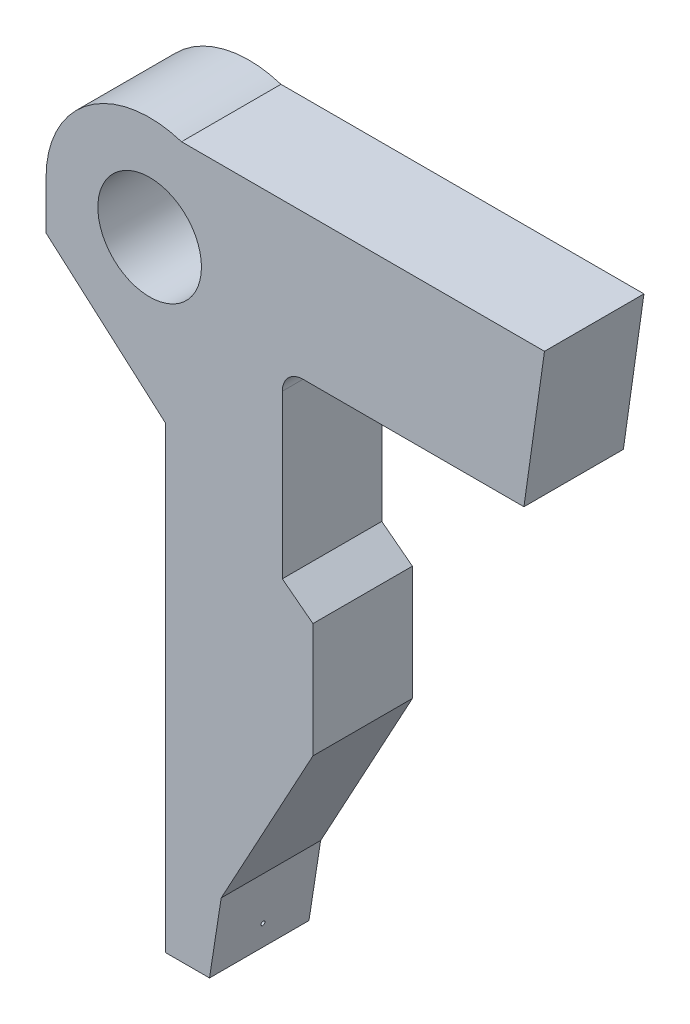
ISO-10303-21;
HEADER;
FILE_DESCRIPTION(('STEP AP214'),'2;1');
FILE_NAME('part.step','',(''),(''),'','','');
FILE_SCHEMA(('AUTOMOTIVE_DESIGN { 1 0 10303 214 1 1 1 1 }'));
ENDSEC;
DATA;
#1=APPLICATION_CONTEXT('core data for automotive mechanical design processes');
#2=APPLICATION_PROTOCOL_DEFINITION('international standard','automotive_design',2000,#1);
#3=PRODUCT_CONTEXT('',#1,'mechanical');
#4=PRODUCT('Part','Part','',(#3));
#5=PRODUCT_RELATED_PRODUCT_CATEGORY('part','',(#4));
#6=PRODUCT_DEFINITION_FORMATION('','',#4);
#7=PRODUCT_DEFINITION_CONTEXT('part definition',#1,'design');
#8=PRODUCT_DEFINITION('design','',#6,#7);
#9=PRODUCT_DEFINITION_SHAPE('','',#8);
#10=(LENGTH_UNIT() NAMED_UNIT(*) SI_UNIT(.MILLI.,.METRE.));
#11=(NAMED_UNIT(*) PLANE_ANGLE_UNIT() SI_UNIT($,.RADIAN.));
#12=(NAMED_UNIT(*) SI_UNIT($,.STERADIAN.) SOLID_ANGLE_UNIT());
#13=UNCERTAINTY_MEASURE_WITH_UNIT(LENGTH_MEASURE(1.E-05),#10,'distance_accuracy_value','');
#14=(GEOMETRIC_REPRESENTATION_CONTEXT(3) GLOBAL_UNCERTAINTY_ASSIGNED_CONTEXT((#13)) GLOBAL_UNIT_ASSIGNED_CONTEXT((#10,
#11,#12)) REPRESENTATION_CONTEXT('',''));
#15=CARTESIAN_POINT('',(0.,0.,0.));
#16=DIRECTION('',(0.,0.,1.));
#17=DIRECTION('',(1.,0.,0.));
#18=AXIS2_PLACEMENT_3D('',#15,#16,#17);
#19=CARTESIAN_POINT('',(6.40208237027269,0.,4.8));
#20=DIRECTION('',(-1.,0.,0.));
#21=DIRECTION('',(0.,-1.,0.));
#22=AXIS2_PLACEMENT_3D('',#19,#20,#21);
#23=PLANE('',#22);
#24=DIRECTION('',(0.,1.,0.));
#25=VECTOR('',#24,1.);
#26=CARTESIAN_POINT('',(6.40208237027269,0.,0.));
#27=LINE('',#26,#25);
#28=CARTESIAN_POINT('',(6.40208237027269,-11.0792552576076,0.));
#29=VERTEX_POINT('',#28);
#30=CARTESIAN_POINT('',(6.40208237027269,-3.2376102121532,0.));
#31=VERTEX_POINT('',#30);
#32=EDGE_CURVE('E171',#29,#31,#27,.T.);
#33=ORIENTED_EDGE('',*,*,#32,.T.);
#34=DIRECTION('',(0.,0.,-1.));
#35=VECTOR('',#34,1.);
#36=CARTESIAN_POINT('',(6.40208237027269,-3.2376102121532,4.8));
#37=LINE('',#36,#35);
#38=CARTESIAN_POINT('',(6.40208237027269,-3.2376102121532,4.8));
#39=VERTEX_POINT('',#38);
#40=EDGE_CURVE('E11',#39,#31,#37,.T.);
#41=ORIENTED_EDGE('',*,*,#40,.F.);
#42=DIRECTION('',(0.,1.,0.));
#43=VECTOR('',#42,1.);
#44=CARTESIAN_POINT('',(6.40208237027269,0.,4.8));
#45=LINE('',#44,#43);
#46=CARTESIAN_POINT('',(6.40208237027269,-11.0792552576076,4.8));
#47=VERTEX_POINT('',#46);
#48=EDGE_CURVE('E201',#47,#39,#45,.T.);
#49=ORIENTED_EDGE('',*,*,#48,.F.);
#50=DIRECTION('',(0.,0.,-1.));
#51=VECTOR('',#50,1.);
#52=CARTESIAN_POINT('',(6.40208237027269,-11.0792552576076,4.8));
#53=LINE('',#52,#51);
#54=EDGE_CURVE('E170',#47,#29,#53,.T.);
#55=ORIENTED_EDGE('',*,*,#54,.T.);
#56=EDGE_LOOP('',(#33,#41,#49,#55));
#57=FACE_BOUND('',#56,.T.);
#58=ADVANCED_FACE('F35',(#57),#23,.F.);
#59=CARTESIAN_POINT('',(7.40208237027269,-3.2376102121532,4.8));
#60=DIRECTION('',(0.,0.,-1.));
#61=DIRECTION('',(-1.,0.,0.));
#62=AXIS2_PLACEMENT_3D('',#59,#60,#61);
#63=CYLINDRICAL_SURFACE('',#62,0.999999999999999);
#64=CARTESIAN_POINT('',(7.40208237027269,-3.2376102121532,0.));
#65=DIRECTION('',(0.,0.,1.));
#66=DIRECTION('',(1.,0.,0.));
#67=AXIS2_PLACEMENT_3D('',#64,#65,#66);
#68=CIRCLE('',#67,0.999999999999999);
#69=CARTESIAN_POINT('',(7.40208237027269,-2.2376102121532,0.));
#70=VERTEX_POINT('',#69);
#71=EDGE_CURVE('E174',#31,#70,#68,.F.);
#72=ORIENTED_EDGE('',*,*,#71,.T.);
#73=DIRECTION('',(0.,0.,-1.));
#74=VECTOR('',#73,1.);
#75=CARTESIAN_POINT('',(7.40208237027269,-2.2376102121532,4.8));
#76=LINE('',#75,#74);
#77=CARTESIAN_POINT('',(7.40208237027269,-2.2376102121532,4.8));
#78=VERTEX_POINT('',#77);
#79=EDGE_CURVE('E43',#78,#70,#76,.T.);
#80=ORIENTED_EDGE('',*,*,#79,.F.);
#81=CARTESIAN_POINT('',(7.40208237027269,-3.2376102121532,4.8));
#82=DIRECTION('',(0.,0.,1.));
#83=DIRECTION('',(1.,0.,0.));
#84=AXIS2_PLACEMENT_3D('',#81,#82,#83);
#85=CIRCLE('',#84,0.999999999999999);
#86=EDGE_CURVE('E112',#39,#78,#85,.F.);
#87=ORIENTED_EDGE('',*,*,#86,.F.);
#88=ORIENTED_EDGE('',*,*,#40,.T.);
#89=EDGE_LOOP('',(#72,#80,#87,#88));
#90=FACE_BOUND('',#89,.T.);
#91=ADVANCED_FACE('F291',(#90),#63,.F.);
#92=CARTESIAN_POINT('',(0.,-2.2376102121532,4.8));
#93=DIRECTION('',(0.,1.,0.));
#94=DIRECTION('',(-1.,0.,0.));
#95=AXIS2_PLACEMENT_3D('',#92,#93,#94);
#96=PLANE('',#95);
#97=DIRECTION('',(1.,0.,0.));
#98=VECTOR('',#97,1.);
#99=CARTESIAN_POINT('',(0.,-2.2376102121532,0.));
#100=LINE('',#99,#98);
#101=CARTESIAN_POINT('',(18.063612226188,-2.2376102121532,0.));
#102=VERTEX_POINT('',#101);
#103=EDGE_CURVE('E177',#70,#102,#100,.T.);
#104=ORIENTED_EDGE('',*,*,#103,.T.);
#105=DIRECTION('',(0.,0.,-1.));
#106=VECTOR('',#105,1.);
#107=CARTESIAN_POINT('',(18.063612226188,-2.2376102121532,4.8));
#108=LINE('',#107,#106);
#109=CARTESIAN_POINT('',(18.063612226188,-2.2376102121532,4.8));
#110=VERTEX_POINT('',#109);
#111=EDGE_CURVE('E226',#110,#102,#108,.T.);
#112=ORIENTED_EDGE('',*,*,#111,.F.);
#113=DIRECTION('',(1.,0.,0.));
#114=VECTOR('',#113,1.);
#115=CARTESIAN_POINT('',(0.,-2.2376102121532,4.8));
#116=LINE('',#115,#114);
#117=EDGE_CURVE('E234',#78,#110,#116,.T.);
#118=ORIENTED_EDGE('',*,*,#117,.F.);
#119=ORIENTED_EDGE('',*,*,#79,.T.);
#120=EDGE_LOOP('',(#104,#112,#118,#119));
#121=FACE_BOUND('',#120,.T.);
#122=ADVANCED_FACE('F232',(#121),#96,.F.);
#123=CARTESIAN_POINT('',(18.0184346235268,-2.55607840833381,4.8));
#124=DIRECTION('',(-0.990087364863809,0.140452874434947,0.));
#125=DIRECTION('',(-0.140452874434947,-0.990087364863809,0.));
#126=AXIS2_PLACEMENT_3D('',#123,#124,#125);
#127=PLANE('',#126);
#128=DIRECTION('',(0.140452874434947,0.990087364863809,0.));
#129=VECTOR('',#128,1.);
#130=CARTESIAN_POINT('',(18.0184346235268,-2.55607840833381,0.));
#131=LINE('',#130,#129);
#132=CARTESIAN_POINT('',(19.0560025989645,4.7579971974597,0.));
#133=VERTEX_POINT('',#132);
#134=EDGE_CURVE('E179',#102,#133,#131,.T.);
#135=ORIENTED_EDGE('',*,*,#134,.T.);
#136=DIRECTION('',(0.,0.,-1.));
#137=VECTOR('',#136,1.);
#138=CARTESIAN_POINT('',(19.0560025989645,4.7579971974597,4.8));
#139=LINE('',#138,#137);
#140=CARTESIAN_POINT('',(19.0560025989645,4.7579971974597,4.8));
#141=VERTEX_POINT('',#140);
#142=EDGE_CURVE('E223',#141,#133,#139,.T.);
#143=ORIENTED_EDGE('',*,*,#142,.F.);
#144=DIRECTION('',(0.140452874434947,0.990087364863809,0.));
#145=VECTOR('',#144,1.);
#146=CARTESIAN_POINT('',(18.0184346235268,-2.55607840833381,4.8));
#147=LINE('',#146,#145);
#148=EDGE_CURVE('E253',#110,#141,#147,.T.);
#149=ORIENTED_EDGE('',*,*,#148,.F.);
#150=ORIENTED_EDGE('',*,*,#111,.T.);
#151=EDGE_LOOP('',(#135,#143,#149,#150));
#152=FACE_BOUND('',#151,.T.);
#153=ADVANCED_FACE('F244',(#152),#127,.F.);
#154=CARTESIAN_POINT('',(0.,4.7579971974597,4.8));
#155=DIRECTION('',(0.,-1.,0.));
#156=DIRECTION('',(0.,0.,-1.));
#157=AXIS2_PLACEMENT_3D('',#154,#155,#156);
#158=PLANE('',#157);
#159=DIRECTION('',(-1.,0.,0.));
#160=VECTOR('',#159,1.);
#161=CARTESIAN_POINT('',(0.,4.7579971974597,0.));
#162=LINE('',#161,#160);
#163=CARTESIAN_POINT('',(1.53670513403374,4.7579971974597,0.));
#164=VERTEX_POINT('',#163);
#165=EDGE_CURVE('E181',#133,#164,#162,.T.);
#166=ORIENTED_EDGE('',*,*,#165,.T.);
#167=DIRECTION('',(0.,0.,-1.));
#168=VECTOR('',#167,1.);
#169=CARTESIAN_POINT('',(1.53670513403374,4.7579971974597,4.8));
#170=LINE('',#169,#168);
#171=CARTESIAN_POINT('',(1.53670513403374,4.7579971974597,4.8));
#172=VERTEX_POINT('',#171);
#173=EDGE_CURVE('E220',#172,#164,#170,.T.);
#174=ORIENTED_EDGE('',*,*,#173,.F.);
#175=DIRECTION('',(-1.,0.,0.));
#176=VECTOR('',#175,1.);
#177=CARTESIAN_POINT('',(0.,4.7579971974597,4.8));
#178=LINE('',#177,#176);
#179=EDGE_CURVE('E250',#141,#172,#178,.T.);
#180=ORIENTED_EDGE('',*,*,#179,.F.);
#181=ORIENTED_EDGE('',*,*,#142,.T.);
#182=EDGE_LOOP('',(#166,#174,#180,#181));
#183=FACE_BOUND('',#182,.T.);
#184=ADVANCED_FACE('F248',(#183),#158,.F.);
#185=CARTESIAN_POINT('',(0.,0.,4.8));
#186=DIRECTION('',(0.,0.,-1.));
#187=DIRECTION('',(-1.,0.,0.));
#188=AXIS2_PLACEMENT_3D('',#185,#186,#187);
#189=CYLINDRICAL_SURFACE('',#188,5.);
#190=CARTESIAN_POINT('',(0.,0.,0.));
#191=DIRECTION('',(0.,0.,1.));
#192=DIRECTION('',(1.,0.,0.));
#193=AXIS2_PLACEMENT_3D('',#190,#191,#192);
#194=CIRCLE('',#193,5.);
#195=CARTESIAN_POINT('',(-5.,0.,0.));
#196=VERTEX_POINT('',#195);
#197=EDGE_CURVE('E183',#164,#196,#194,.T.);
#198=ORIENTED_EDGE('',*,*,#197,.T.);
#199=DIRECTION('',(0.,0.,-1.));
#200=VECTOR('',#199,1.);
#201=CARTESIAN_POINT('',(-5.,0.,4.8));
#202=LINE('',#201,#200);
#203=CARTESIAN_POINT('',(-5.,0.,4.8));
#204=VERTEX_POINT('',#203);
#205=EDGE_CURVE('E217',#204,#196,#202,.T.);
#206=ORIENTED_EDGE('',*,*,#205,.F.);
#207=CARTESIAN_POINT('',(0.,0.,4.8));
#208=DIRECTION('',(0.,0.,1.));
#209=DIRECTION('',(1.,0.,0.));
#210=AXIS2_PLACEMENT_3D('',#207,#208,#209);
#211=CIRCLE('',#210,5.);
#212=EDGE_CURVE('E252',#172,#204,#211,.T.);
#213=ORIENTED_EDGE('',*,*,#212,.F.);
#214=ORIENTED_EDGE('',*,*,#173,.T.);
#215=EDGE_LOOP('',(#198,#206,#213,#214));
#216=FACE_BOUND('',#215,.T.);
#217=ADVANCED_FACE('F304',(#216),#189,.T.);
#218=CARTESIAN_POINT('',(-5.,0.,4.8));
#219=DIRECTION('',(1.,0.,0.));
#220=DIRECTION('',(0.,0.,-1.));
#221=AXIS2_PLACEMENT_3D('',#218,#219,#220);
#222=PLANE('',#221);
#223=DIRECTION('',(0.,-1.,0.));
#224=VECTOR('',#223,1.);
#225=CARTESIAN_POINT('',(-5.,0.,0.));
#226=LINE('',#225,#224);
#227=CARTESIAN_POINT('',(-5.,-2.32647439688253,0.));
#228=VERTEX_POINT('',#227);
#229=EDGE_CURVE('E185',#196,#228,#226,.T.);
#230=ORIENTED_EDGE('',*,*,#229,.T.);
#231=DIRECTION('',(0.,0.,-1.));
#232=VECTOR('',#231,1.);
#233=CARTESIAN_POINT('',(-5.,-2.32647439688253,4.8));
#234=LINE('',#233,#232);
#235=CARTESIAN_POINT('',(-5.,-2.32647439688253,4.8));
#236=VERTEX_POINT('',#235);
#237=EDGE_CURVE('E214',#236,#228,#234,.T.);
#238=ORIENTED_EDGE('',*,*,#237,.F.);
#239=DIRECTION('',(0.,-1.,0.));
#240=VECTOR('',#239,1.);
#241=CARTESIAN_POINT('',(-5.,0.,4.8));
#242=LINE('',#241,#240);
#243=EDGE_CURVE('E255',#204,#236,#242,.T.);
#244=ORIENTED_EDGE('',*,*,#243,.F.);
#245=ORIENTED_EDGE('',*,*,#205,.T.);
#246=EDGE_LOOP('',(#230,#238,#244,#245));
#247=FACE_BOUND('',#246,.T.);
#248=ADVANCED_FACE('F307',(#247),#222,.F.);
#249=CARTESIAN_POINT('',(-3.32960365921922,-3.79285286398016,4.8));
#250=DIRECTION('',(0.659722162079872,0.751509593325767,0.));
#251=DIRECTION('',(-0.751509593325767,0.659722162079872,0.));
#252=AXIS2_PLACEMENT_3D('',#249,#250,#251);
#253=PLANE('',#252);
#254=DIRECTION('',(0.751509593325767,-0.659722162079872,0.));
#255=VECTOR('',#254,1.);
#256=CARTESIAN_POINT('',(-3.32960365921922,-3.79285286398016,0.));
#257=LINE('',#256,#255);
#258=CARTESIAN_POINT('',(0.754164722411706,-7.3778403745722,0.));
#259=VERTEX_POINT('',#258);
#260=EDGE_CURVE('E187',#228,#259,#257,.T.);
#261=ORIENTED_EDGE('',*,*,#260,.T.);
#262=DIRECTION('',(0.,0.,-1.));
#263=VECTOR('',#262,1.);
#264=CARTESIAN_POINT('',(0.754164722411706,-7.3778403745722,4.8));
#265=LINE('',#264,#263);
#266=CARTESIAN_POINT('',(0.754164722411706,-7.3778403745722,4.8));
#267=VERTEX_POINT('',#266);
#268=EDGE_CURVE('E211',#267,#259,#265,.T.);
#269=ORIENTED_EDGE('',*,*,#268,.F.);
#270=DIRECTION('',(0.751509593325767,-0.659722162079872,0.));
#271=VECTOR('',#270,1.);
#272=CARTESIAN_POINT('',(-3.32960365921922,-3.79285286398016,4.8));
#273=LINE('',#272,#271);
#274=EDGE_CURVE('E261',#236,#267,#273,.T.);
#275=ORIENTED_EDGE('',*,*,#274,.F.);
#276=ORIENTED_EDGE('',*,*,#237,.T.);
#277=EDGE_LOOP('',(#261,#269,#275,#276));
#278=FACE_BOUND('',#277,.T.);
#279=ADVANCED_FACE('F311',(#278),#253,.F.);
#280=CARTESIAN_POINT('',(0.754164722411706,0.,4.8));
#281=DIRECTION('',(1.,0.,0.));
#282=DIRECTION('',(0.,0.,-1.));
#283=AXIS2_PLACEMENT_3D('',#280,#281,#282);
#284=PLANE('',#283);
#285=CARTESIAN_POINT('',(0.754164722411706,-27.0198901160511,2.4));
#286=DIRECTION('',(-1.,0.,0.));
#287=DIRECTION('',(0.,0.,1.));
#288=AXIS2_PLACEMENT_3D('',#285,#286,#287);
#289=CIRCLE('',#288,1.825);
#290=CARTESIAN_POINT('',(0.754164722411706,-27.0198901160511,4.225));
#291=VERTEX_POINT('',#290);
#292=EDGE_CURVE('E414',#291,#291,#289,.T.);
#293=ORIENTED_EDGE('',*,*,#292,.F.);
#294=EDGE_LOOP('',(#293));
#295=FACE_BOUND('',#294,.T.);
#296=DIRECTION('',(0.,-1.,0.));
#297=VECTOR('',#296,1.);
#298=CARTESIAN_POINT('',(0.754164722411706,0.,0.));
#299=LINE('',#298,#297);
#300=CARTESIAN_POINT('',(0.754164722411706,-29.5198901160511,0.));
#301=VERTEX_POINT('',#300);
#302=EDGE_CURVE('E189',#259,#301,#299,.T.);
#303=ORIENTED_EDGE('',*,*,#302,.T.);
#304=DIRECTION('',(0.,0.,-1.));
#305=VECTOR('',#304,1.);
#306=CARTESIAN_POINT('',(0.754164722411706,-29.5198901160511,4.8));
#307=LINE('',#306,#305);
#308=CARTESIAN_POINT('',(0.754164722411706,-29.5198901160511,4.8));
#309=VERTEX_POINT('',#308);
#310=EDGE_CURVE('E208',#309,#301,#307,.T.);
#311=ORIENTED_EDGE('',*,*,#310,.F.);
#312=DIRECTION('',(0.,-1.,0.));
#313=VECTOR('',#312,1.);
#314=CARTESIAN_POINT('',(0.754164722411706,0.,4.8));
#315=LINE('',#314,#313);
#316=EDGE_CURVE('E263',#267,#309,#315,.T.);
#317=ORIENTED_EDGE('',*,*,#316,.F.);
#318=ORIENTED_EDGE('',*,*,#268,.T.);
#319=EDGE_LOOP('',(#303,#311,#317,#318));
#320=FACE_BOUND('',#319,.T.);
#321=ADVANCED_FACE('F315',(#295,#320),#284,.F.);
#322=CARTESIAN_POINT('',(-2.39866646747301E-13,-29.519890116051,4.8));
#323=DIRECTION('',(0.,1.,0.));
#324=DIRECTION('',(-1.,0.,0.));
#325=AXIS2_PLACEMENT_3D('',#322,#323,#324);
#326=PLANE('',#325);
#327=DIRECTION('',(1.,0.,0.));
#328=VECTOR('',#327,1.);
#329=CARTESIAN_POINT('',(-2.39866646747301E-13,-29.519890116051,0.));
#330=LINE('',#329,#328);
#331=CARTESIAN_POINT('',(2.88905288160283,-29.5198901160511,0.));
#332=VERTEX_POINT('',#331);
#333=EDGE_CURVE('E191',#301,#332,#330,.T.);
#334=ORIENTED_EDGE('',*,*,#333,.T.);
#335=DIRECTION('',(0.,0.,-1.));
#336=VECTOR('',#335,1.);
#337=CARTESIAN_POINT('',(2.88905288160283,-29.5198901160511,4.8));
#338=LINE('',#337,#336);
#339=CARTESIAN_POINT('',(2.88905288160283,-29.5198901160511,4.8));
#340=VERTEX_POINT('',#339);
#341=EDGE_CURVE('E205',#340,#332,#338,.T.);
#342=ORIENTED_EDGE('',*,*,#341,.F.);
#343=DIRECTION('',(1.,0.,0.));
#344=VECTOR('',#343,1.);
#345=CARTESIAN_POINT('',(-2.39866646747301E-13,-29.519890116051,4.8));
#346=LINE('',#345,#344);
#347=EDGE_CURVE('E265',#309,#340,#346,.T.);
#348=ORIENTED_EDGE('',*,*,#347,.F.);
#349=ORIENTED_EDGE('',*,*,#310,.T.);
#350=EDGE_LOOP('',(#334,#342,#348,#349));
#351=FACE_BOUND('',#350,.T.);
#352=ADVANCED_FACE('F271',(#351),#326,.F.);
#353=CARTESIAN_POINT('',(7.29737212162931,-1.13324948681235,4.8));
#354=DIRECTION('',(-0.988155457698499,0.153456154717463,0.));
#355=DIRECTION('',(-0.153456154717463,-0.988155457698499,0.));
#356=AXIS2_PLACEMENT_3D('',#353,#354,#355);
#357=PLANE('',#356);
#358=CARTESIAN_POINT('',(3.07152516406432,-28.3448901160511,2.4));
#359=DIRECTION('',(-0.988155457698499,0.153456154717463,0.));
#360=DIRECTION('',(-0.153456154717463,-0.988155457698499,0.));
#361=AXIS2_PLACEMENT_3D('',#358,#359,#360);
#362=ELLIPSE('',#361,0.101198651711046,0.0999999999999997);
#363=CARTESIAN_POINT('',(3.05599560811015,-28.4448901160511,2.4));
#364=VERTEX_POINT('',#363);
#365=EDGE_CURVE('E413',#364,#364,#362,.F.);
#366=ORIENTED_EDGE('',*,*,#365,.F.);
#367=EDGE_LOOP('',(#366));
#368=FACE_BOUND('',#367,.T.);
#369=DIRECTION('',(0.153456154717463,0.988155457698499,0.));
#370=VECTOR('',#369,1.);
#371=CARTESIAN_POINT('',(7.29737212162931,-1.13324948681235,0.));
#372=LINE('',#371,#370);
#373=CARTESIAN_POINT('',(3.45262694445621,-25.8908484067027,0.));
#374=VERTEX_POINT('',#373);
#375=EDGE_CURVE('E193',#332,#374,#372,.T.);
#376=ORIENTED_EDGE('',*,*,#375,.T.);
#377=DIRECTION('',(0.,0.,-1.));
#378=VECTOR('',#377,1.);
#379=CARTESIAN_POINT('',(3.45262694445621,-25.8908484067027,4.8));
#380=LINE('',#379,#378);
#381=CARTESIAN_POINT('',(3.45262694445621,-25.8908484067027,4.8));
#382=VERTEX_POINT('',#381);
#383=EDGE_CURVE('E159',#382,#374,#380,.T.);
#384=ORIENTED_EDGE('',*,*,#383,.F.);
#385=DIRECTION('',(0.153456154717463,0.988155457698499,0.));
#386=VECTOR('',#385,1.);
#387=CARTESIAN_POINT('',(7.29737212162931,-1.13324948681235,4.8));
#388=LINE('',#387,#386);
#389=EDGE_CURVE('E150',#340,#382,#388,.T.);
#390=ORIENTED_EDGE('',*,*,#389,.F.);
#391=ORIENTED_EDGE('',*,*,#341,.T.);
#392=EDGE_LOOP('',(#376,#384,#390,#391));
#393=FACE_BOUND('',#392,.T.);
#394=ADVANCED_FACE('F275',(#368,#393),#357,.F.);
#395=CARTESIAN_POINT('',(13.5263332156528,-7.34866620752027,4.8));
#396=DIRECTION('',(-0.878695413301182,0.477382834466704,0.));
#397=DIRECTION('',(-0.477382834466704,-0.878695413301182,0.));
#398=AXIS2_PLACEMENT_3D('',#395,#396,#397);
#399=PLANE('',#398);
#400=DIRECTION('',(0.477382834466704,0.878695413301182,0.));
#401=VECTOR('',#400,1.);
#402=CARTESIAN_POINT('',(13.5263332156528,-7.34866620752027,0.));
#403=LINE('',#402,#401);
#404=CARTESIAN_POINT('',(7.88035743742888,-17.7409397912093,0.));
#405=VERTEX_POINT('',#404);
#406=EDGE_CURVE('E158',#374,#405,#403,.T.);
#407=ORIENTED_EDGE('',*,*,#406,.T.);
#408=DIRECTION('',(0.,0.,-1.));
#409=VECTOR('',#408,1.);
#410=CARTESIAN_POINT('',(7.88035743742888,-17.7409397912093,4.8));
#411=LINE('',#410,#409);
#412=CARTESIAN_POINT('',(7.88035743742888,-17.7409397912093,4.8));
#413=VERTEX_POINT('',#412);
#414=EDGE_CURVE('E155',#413,#405,#411,.T.);
#415=ORIENTED_EDGE('',*,*,#414,.F.);
#416=DIRECTION('',(0.477382834466704,0.878695413301182,0.));
#417=VECTOR('',#416,1.);
#418=CARTESIAN_POINT('',(13.5263332156528,-7.34866620752027,4.8));
#419=LINE('',#418,#417);
#420=EDGE_CURVE('E143',#382,#413,#419,.T.);
#421=ORIENTED_EDGE('',*,*,#420,.F.);
#422=ORIENTED_EDGE('',*,*,#383,.T.);
#423=EDGE_LOOP('',(#407,#415,#421,#422));
#424=FACE_BOUND('',#423,.T.);
#425=ADVANCED_FACE('F156',(#424),#399,.F.);
#426=CARTESIAN_POINT('',(7.88035743742888,0.,4.8));
#427=DIRECTION('',(-1.,0.,0.));
#428=DIRECTION('',(0.,0.,1.));
#429=AXIS2_PLACEMENT_3D('',#426,#427,#428);
#430=PLANE('',#429);
#431=DIRECTION('',(0.,1.,0.));
#432=VECTOR('',#431,1.);
#433=CARTESIAN_POINT('',(7.88035743742888,0.,0.));
#434=LINE('',#433,#432);
#435=CARTESIAN_POINT('',(7.88035743742888,-12.211059605899,0.));
#436=VERTEX_POINT('',#435);
#437=EDGE_CURVE('E98',#405,#436,#434,.T.);
#438=ORIENTED_EDGE('',*,*,#437,.T.);
#439=DIRECTION('',(0.,0.,-1.));
#440=VECTOR('',#439,1.);
#441=CARTESIAN_POINT('',(7.88035743742888,-12.211059605899,4.8));
#442=LINE('',#441,#440);
#443=CARTESIAN_POINT('',(7.88035743742888,-12.211059605899,4.8));
#444=VERTEX_POINT('',#443);
#445=EDGE_CURVE('E160',#444,#436,#442,.T.);
#446=ORIENTED_EDGE('',*,*,#445,.F.);
#447=DIRECTION('',(0.,1.,0.));
#448=VECTOR('',#447,1.);
#449=CARTESIAN_POINT('',(7.88035743742888,0.,4.8));
#450=LINE('',#449,#448);
#451=EDGE_CURVE('E148',#413,#444,#450,.T.);
#452=ORIENTED_EDGE('',*,*,#451,.F.);
#453=ORIENTED_EDGE('',*,*,#414,.T.);
#454=EDGE_LOOP('',(#438,#446,#452,#453));
#455=FACE_BOUND('',#454,.T.);
#456=ADVANCED_FACE('F162',(#455),#430,.F.);
#457=CARTESIAN_POINT('',(-2.98186004568765,-3.89467434538796,4.8));
#458=DIRECTION('',(-0.607910502716912,-0.794005554569029,0.));
#459=DIRECTION('',(0.794005554569029,-0.607910502716912,0.));
#460=AXIS2_PLACEMENT_3D('',#457,#458,#459);
#461=PLANE('',#460);
#462=DIRECTION('',(-0.794005554569029,0.607910502716912,0.));
#463=VECTOR('',#462,1.);
#464=CARTESIAN_POINT('',(-2.98186004568765,-3.89467434538796,0.));
#465=LINE('',#464,#463);
#466=EDGE_CURVE('E104',#436,#29,#465,.T.);
#467=ORIENTED_EDGE('',*,*,#466,.T.);
#468=ORIENTED_EDGE('',*,*,#54,.F.);
#469=DIRECTION('',(-0.794005554569029,0.607910502716912,0.));
#470=VECTOR('',#469,1.);
#471=CARTESIAN_POINT('',(-2.98186004568765,-3.89467434538796,4.8));
#472=LINE('',#471,#470);
#473=EDGE_CURVE('E51',#444,#47,#472,.T.);
#474=ORIENTED_EDGE('',*,*,#473,.F.);
#475=ORIENTED_EDGE('',*,*,#445,.T.);
#476=EDGE_LOOP('',(#467,#468,#474,#475));
#477=FACE_BOUND('',#476,.T.);
#478=ADVANCED_FACE('F279',(#477),#461,.F.);
#479=CARTESIAN_POINT('',(0.,0.,4.8));
#480=DIRECTION('',(0.,0.,-1.));
#481=DIRECTION('',(-1.,0.,0.));
#482=AXIS2_PLACEMENT_3D('',#479,#480,#481);
#483=CYLINDRICAL_SURFACE('',#482,2.5);
#484=CARTESIAN_POINT('',(0.,0.,4.8));
#485=DIRECTION('',(0.,0.,1.));
#486=DIRECTION('',(1.,0.,0.));
#487=AXIS2_PLACEMENT_3D('',#484,#485,#486);
#488=CIRCLE('',#487,2.5);
#489=CARTESIAN_POINT('',(2.5,0.,4.8));
#490=VERTEX_POINT('',#489);
#491=EDGE_CURVE('E164',#490,#490,#488,.T.);
#492=ORIENTED_EDGE('',*,*,#491,.T.);
#493=EDGE_LOOP('',(#492));
#494=FACE_BOUND('',#493,.T.);
#495=CARTESIAN_POINT('',(0.,0.,0.));
#496=DIRECTION('',(0.,0.,1.));
#497=DIRECTION('',(1.,0.,0.));
#498=AXIS2_PLACEMENT_3D('',#495,#496,#497);
#499=CIRCLE('',#498,2.5);
#500=CARTESIAN_POINT('',(2.5,0.,0.));
#501=VERTEX_POINT('',#500);
#502=EDGE_CURVE('E198',#501,#501,#499,.T.);
#503=ORIENTED_EDGE('',*,*,#502,.F.);
#504=EDGE_LOOP('',(#503));
#505=FACE_BOUND('',#504,.T.);
#506=ADVANCED_FACE('F281',(#494,#505),#483,.F.);
#507=CARTESIAN_POINT('',(0.,0.,4.8));
#508=DIRECTION('',(0.,0.,1.));
#509=DIRECTION('',(1.,0.,0.));
#510=AXIS2_PLACEMENT_3D('',#507,#508,#509);
#511=PLANE('',#510);
#512=ORIENTED_EDGE('',*,*,#48,.T.);
#513=ORIENTED_EDGE('',*,*,#86,.T.);
#514=ORIENTED_EDGE('',*,*,#117,.T.);
#515=ORIENTED_EDGE('',*,*,#148,.T.);
#516=ORIENTED_EDGE('',*,*,#179,.T.);
#517=ORIENTED_EDGE('',*,*,#212,.T.);
#518=ORIENTED_EDGE('',*,*,#243,.T.);
#519=ORIENTED_EDGE('',*,*,#274,.T.);
#520=ORIENTED_EDGE('',*,*,#316,.T.);
#521=ORIENTED_EDGE('',*,*,#347,.T.);
#522=ORIENTED_EDGE('',*,*,#389,.T.);
#523=ORIENTED_EDGE('',*,*,#420,.T.);
#524=ORIENTED_EDGE('',*,*,#451,.T.);
#525=ORIENTED_EDGE('',*,*,#473,.T.);
#526=EDGE_LOOP('',(#512,#513,#514,#515,#516,#517,#518,#519,#520,#521,#522,#523,#524,#525));
#527=FACE_BOUND('',#526,.T.);
#528=ORIENTED_EDGE('',*,*,#491,.F.);
#529=EDGE_LOOP('',(#528));
#530=FACE_BOUND('',#529,.T.);
#531=ADVANCED_FACE('F145',(#527,#530),#511,.T.);
#532=CARTESIAN_POINT('',(0.,0.,0.));
#533=DIRECTION('',(0.,0.,1.));
#534=DIRECTION('',(1.,0.,0.));
#535=AXIS2_PLACEMENT_3D('',#532,#533,#534);
#536=PLANE('',#535);
#537=ORIENTED_EDGE('',*,*,#32,.F.);
#538=ORIENTED_EDGE('',*,*,#466,.F.);
#539=ORIENTED_EDGE('',*,*,#437,.F.);
#540=ORIENTED_EDGE('',*,*,#406,.F.);
#541=ORIENTED_EDGE('',*,*,#375,.F.);
#542=ORIENTED_EDGE('',*,*,#333,.F.);
#543=ORIENTED_EDGE('',*,*,#302,.F.);
#544=ORIENTED_EDGE('',*,*,#260,.F.);
#545=ORIENTED_EDGE('',*,*,#229,.F.);
#546=ORIENTED_EDGE('',*,*,#197,.F.);
#547=ORIENTED_EDGE('',*,*,#165,.F.);
#548=ORIENTED_EDGE('',*,*,#134,.F.);
#549=ORIENTED_EDGE('',*,*,#103,.F.);
#550=ORIENTED_EDGE('',*,*,#71,.F.);
#551=EDGE_LOOP('',(#537,#538,#539,#540,#541,#542,#543,#544,#545,#546,#547,#548,#549,#550));
#552=FACE_BOUND('',#551,.T.);
#553=ORIENTED_EDGE('',*,*,#502,.T.);
#554=EDGE_LOOP('',(#553));
#555=FACE_BOUND('',#554,.T.);
#556=ADVANCED_FACE('F238',(#552,#555),#536,.F.);
#557=CARTESIAN_POINT('',(2.75416472241171,-27.0198901160511,2.4));
#558=DIRECTION('',(-1.,0.,0.));
#559=DIRECTION('',(0.,0.,1.));
#560=AXIS2_PLACEMENT_3D('',#557,#558,#559);
#561=CYLINDRICAL_SURFACE('',#560,1.825);
#562=CARTESIAN_POINT('',(2.75416472241171,-27.0198901160511,2.4));
#563=DIRECTION('',(-1.,0.,0.));
#564=DIRECTION('',(0.,0.,1.));
#565=AXIS2_PLACEMENT_3D('',#562,#563,#564);
#566=CIRCLE('',#565,1.825);
#567=CARTESIAN_POINT('',(2.75416472241171,-27.0198901160511,4.225));
#568=VERTEX_POINT('',#567);
#569=EDGE_CURVE('E175',#568,#568,#566,.T.);
#570=ORIENTED_EDGE('',*,*,#569,.F.);
#571=EDGE_LOOP('',(#570));
#572=FACE_BOUND('',#571,.T.);
#573=ORIENTED_EDGE('',*,*,#292,.T.);
#574=EDGE_LOOP('',(#573));
#575=FACE_BOUND('',#574,.T.);
#576=ADVANCED_FACE('F365',(#572,#575),#561,.F.);
#577=CARTESIAN_POINT('',(2.75416472241171,-27.0198901160511,2.4));
#578=DIRECTION('',(-1.,0.,0.));
#579=DIRECTION('',(0.,0.,1.));
#580=AXIS2_PLACEMENT_3D('',#577,#578,#579);
#581=PLANE('',#580);
#582=CARTESIAN_POINT('',(2.75416472241171,-28.3448901160511,2.4));
#583=DIRECTION('',(-1.,0.,0.));
#584=DIRECTION('',(0.,0.,1.));
#585=AXIS2_PLACEMENT_3D('',#582,#583,#584);
#586=CIRCLE('',#585,0.0999999999999997);
#587=CARTESIAN_POINT('',(2.75416472241171,-28.3448901160511,2.5));
#588=VERTEX_POINT('',#587);
#589=EDGE_CURVE('E410',#588,#588,#586,.T.);
#590=ORIENTED_EDGE('',*,*,#589,.F.);
#591=EDGE_LOOP('',(#590));
#592=FACE_BOUND('',#591,.T.);
#593=ORIENTED_EDGE('',*,*,#569,.T.);
#594=EDGE_LOOP('',(#593));
#595=FACE_BOUND('',#594,.T.);
#596=ADVANCED_FACE('F381',(#592,#595),#581,.T.);
#597=CARTESIAN_POINT('',(19.0570025989645,-28.3448901160511,2.4));
#598=DIRECTION('',(-1.,0.,0.));
#599=DIRECTION('',(0.,0.,1.));
#600=AXIS2_PLACEMENT_3D('',#597,#598,#599);
#601=CYLINDRICAL_SURFACE('',#600,0.0999999999999997);
#602=ORIENTED_EDGE('',*,*,#589,.T.);
#603=EDGE_LOOP('',(#602));
#604=FACE_BOUND('',#603,.T.);
#605=ORIENTED_EDGE('',*,*,#365,.T.);
#606=EDGE_LOOP('',(#605));
#607=FACE_BOUND('',#606,.T.);
#608=ADVANCED_FACE('F393',(#604,#607),#601,.F.);
#609=CLOSED_SHELL('',(#58,#91,#122,#153,#184,#217,#248,#279,#321,#352,#394,#425,#456,#478,#506,
#531,#556,#576,#596,#608));
#610=MANIFOLD_SOLID_BREP('B2',#609);
#611=ADVANCED_BREP_SHAPE_REPRESENTATION('',(#18,#610),#14);
#612=SHAPE_DEFINITION_REPRESENTATION(#9,#611);
ENDSEC;
END-ISO-10303-21;
